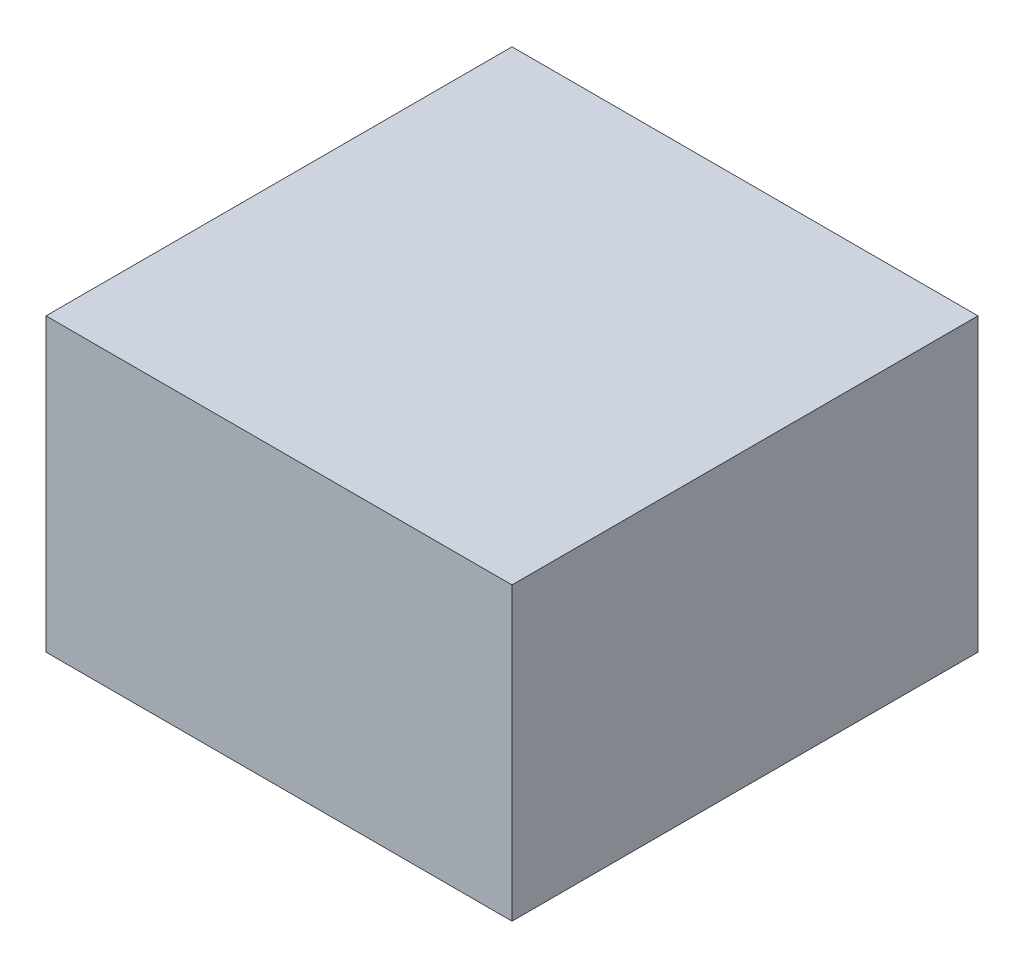
ISO-10303-21;
HEADER;
FILE_DESCRIPTION(('STEP AP214'),'2;1');
FILE_NAME('part.step','',(''),(''),'','','');
FILE_SCHEMA(('AUTOMOTIVE_DESIGN { 1 0 10303 214 1 1 1 1 }'));
ENDSEC;
DATA;
#1=APPLICATION_CONTEXT('core data for automotive mechanical design processes');
#2=APPLICATION_PROTOCOL_DEFINITION('international standard','automotive_design',2000,#1);
#3=PRODUCT_CONTEXT('',#1,'mechanical');
#4=PRODUCT('Part','Part','',(#3));
#5=PRODUCT_RELATED_PRODUCT_CATEGORY('part','',(#4));
#6=PRODUCT_DEFINITION_FORMATION('','',#4);
#7=PRODUCT_DEFINITION_CONTEXT('part definition',#1,'design');
#8=PRODUCT_DEFINITION('design','',#6,#7);
#9=PRODUCT_DEFINITION_SHAPE('','',#8);
#10=(LENGTH_UNIT() NAMED_UNIT(*) SI_UNIT(.MILLI.,.METRE.));
#11=(NAMED_UNIT(*) PLANE_ANGLE_UNIT() SI_UNIT($,.RADIAN.));
#12=(NAMED_UNIT(*) SI_UNIT($,.STERADIAN.) SOLID_ANGLE_UNIT());
#13=UNCERTAINTY_MEASURE_WITH_UNIT(LENGTH_MEASURE(1.E-05),#10,'distance_accuracy_value','');
#14=(GEOMETRIC_REPRESENTATION_CONTEXT(3) GLOBAL_UNCERTAINTY_ASSIGNED_CONTEXT((#13)) GLOBAL_UNIT_ASSIGNED_CONTEXT((#10,
#11,#12)) REPRESENTATION_CONTEXT('',''));
#15=CARTESIAN_POINT('',(0.,0.,0.));
#16=DIRECTION('',(0.,0.,1.));
#17=DIRECTION('',(1.,0.,0.));
#18=AXIS2_PLACEMENT_3D('',#15,#16,#17);
#19=CARTESIAN_POINT('',(0.,25.,40.));
#20=DIRECTION('',(1.,0.,0.));
#21=DIRECTION('',(0.,0.,-1.));
#22=AXIS2_PLACEMENT_3D('',#19,#20,#21);
#23=PLANE('',#22);
#24=DIRECTION('',(0.,-1.,0.));
#25=VECTOR('',#24,1.);
#26=CARTESIAN_POINT('',(0.,25.,0.));
#27=LINE('',#26,#25);
#28=CARTESIAN_POINT('',(0.,25.,0.));
#29=VERTEX_POINT('',#28);
#30=CARTESIAN_POINT('',(0.,0.,0.));
#31=VERTEX_POINT('',#30);
#32=EDGE_CURVE('E102',#29,#31,#27,.T.);
#33=ORIENTED_EDGE('',*,*,#32,.T.);
#34=DIRECTION('',(0.,0.,-1.));
#35=VECTOR('',#34,1.);
#36=CARTESIAN_POINT('',(0.,0.,40.));
#37=LINE('',#36,#35);
#38=CARTESIAN_POINT('',(0.,0.,40.));
#39=VERTEX_POINT('',#38);
#40=EDGE_CURVE('E11',#39,#31,#37,.T.);
#41=ORIENTED_EDGE('',*,*,#40,.F.);
#42=DIRECTION('',(0.,-1.,0.));
#43=VECTOR('',#42,1.);
#44=CARTESIAN_POINT('',(0.,25.,40.));
#45=LINE('',#44,#43);
#46=CARTESIAN_POINT('',(0.,25.,40.));
#47=VERTEX_POINT('',#46);
#48=EDGE_CURVE('E90',#47,#39,#45,.T.);
#49=ORIENTED_EDGE('',*,*,#48,.F.);
#50=DIRECTION('',(0.,0.,-1.));
#51=VECTOR('',#50,1.);
#52=CARTESIAN_POINT('',(0.,25.,40.));
#53=LINE('',#52,#51);
#54=EDGE_CURVE('E98',#47,#29,#53,.T.);
#55=ORIENTED_EDGE('',*,*,#54,.T.);
#56=EDGE_LOOP('',(#33,#41,#49,#55));
#57=FACE_BOUND('',#56,.T.);
#58=ADVANCED_FACE('F39',(#57),#23,.F.);
#59=CARTESIAN_POINT('',(0.,0.,40.));
#60=DIRECTION('',(0.,1.,0.));
#61=DIRECTION('',(0.,0.,1.));
#62=AXIS2_PLACEMENT_3D('',#59,#60,#61);
#63=PLANE('',#62);
#64=DIRECTION('',(1.,0.,0.));
#65=VECTOR('',#64,1.);
#66=CARTESIAN_POINT('',(0.,0.,0.));
#67=LINE('',#66,#65);
#68=CARTESIAN_POINT('',(40.,0.,0.));
#69=VERTEX_POINT('',#68);
#70=EDGE_CURVE('E94',#31,#69,#67,.T.);
#71=ORIENTED_EDGE('',*,*,#70,.T.);
#72=DIRECTION('',(0.,0.,-1.));
#73=VECTOR('',#72,1.);
#74=CARTESIAN_POINT('',(40.,0.,40.));
#75=LINE('',#74,#73);
#76=CARTESIAN_POINT('',(40.,0.,40.));
#77=VERTEX_POINT('',#76);
#78=EDGE_CURVE('E47',#77,#69,#75,.T.);
#79=ORIENTED_EDGE('',*,*,#78,.F.);
#80=DIRECTION('',(1.,0.,0.));
#81=VECTOR('',#80,1.);
#82=CARTESIAN_POINT('',(0.,0.,40.));
#83=LINE('',#82,#81);
#84=EDGE_CURVE('E85',#39,#77,#83,.T.);
#85=ORIENTED_EDGE('',*,*,#84,.F.);
#86=ORIENTED_EDGE('',*,*,#40,.T.);
#87=EDGE_LOOP('',(#71,#79,#85,#86));
#88=FACE_BOUND('',#87,.T.);
#89=ADVANCED_FACE('F93',(#88),#63,.F.);
#90=CARTESIAN_POINT('',(40.,0.,40.));
#91=DIRECTION('',(-1.,0.,0.));
#92=DIRECTION('',(0.,0.,1.));
#93=AXIS2_PLACEMENT_3D('',#90,#91,#92);
#94=PLANE('',#93);
#95=DIRECTION('',(0.,1.,0.));
#96=VECTOR('',#95,1.);
#97=CARTESIAN_POINT('',(40.,0.,0.));
#98=LINE('',#97,#96);
#99=CARTESIAN_POINT('',(40.,25.,0.));
#100=VERTEX_POINT('',#99);
#101=EDGE_CURVE('E72',#69,#100,#98,.T.);
#102=ORIENTED_EDGE('',*,*,#101,.T.);
#103=DIRECTION('',(0.,0.,-1.));
#104=VECTOR('',#103,1.);
#105=CARTESIAN_POINT('',(40.,25.,40.));
#106=LINE('',#105,#104);
#107=CARTESIAN_POINT('',(40.,25.,40.));
#108=VERTEX_POINT('',#107);
#109=EDGE_CURVE('E95',#108,#100,#106,.T.);
#110=ORIENTED_EDGE('',*,*,#109,.F.);
#111=DIRECTION('',(0.,1.,0.));
#112=VECTOR('',#111,1.);
#113=CARTESIAN_POINT('',(40.,0.,40.));
#114=LINE('',#113,#112);
#115=EDGE_CURVE('E88',#77,#108,#114,.T.);
#116=ORIENTED_EDGE('',*,*,#115,.F.);
#117=ORIENTED_EDGE('',*,*,#78,.T.);
#118=EDGE_LOOP('',(#102,#110,#116,#117));
#119=FACE_BOUND('',#118,.T.);
#120=ADVANCED_FACE('F96',(#119),#94,.F.);
#121=CARTESIAN_POINT('',(40.,25.,40.));
#122=DIRECTION('',(0.,-1.,0.));
#123=DIRECTION('',(0.,0.,-1.));
#124=AXIS2_PLACEMENT_3D('',#121,#122,#123);
#125=PLANE('',#124);
#126=DIRECTION('',(-1.,0.,0.));
#127=VECTOR('',#126,1.);
#128=CARTESIAN_POINT('',(40.,25.,0.));
#129=LINE('',#128,#127);
#130=EDGE_CURVE('E78',#100,#29,#129,.T.);
#131=ORIENTED_EDGE('',*,*,#130,.T.);
#132=ORIENTED_EDGE('',*,*,#54,.F.);
#133=DIRECTION('',(-1.,0.,0.));
#134=VECTOR('',#133,1.);
#135=CARTESIAN_POINT('',(40.,25.,40.));
#136=LINE('',#135,#134);
#137=EDGE_CURVE('E55',#108,#47,#136,.T.);
#138=ORIENTED_EDGE('',*,*,#137,.F.);
#139=ORIENTED_EDGE('',*,*,#109,.T.);
#140=EDGE_LOOP('',(#131,#132,#138,#139));
#141=FACE_BOUND('',#140,.T.);
#142=ADVANCED_FACE('F109',(#141),#125,.F.);
#143=CARTESIAN_POINT('',(0.,0.,40.));
#144=DIRECTION('',(0.,0.,1.));
#145=DIRECTION('',(1.,0.,0.));
#146=AXIS2_PLACEMENT_3D('',#143,#144,#145);
#147=PLANE('',#146);
#148=ORIENTED_EDGE('',*,*,#48,.T.);
#149=ORIENTED_EDGE('',*,*,#84,.T.);
#150=ORIENTED_EDGE('',*,*,#115,.T.);
#151=ORIENTED_EDGE('',*,*,#137,.T.);
#152=EDGE_LOOP('',(#148,#149,#150,#151));
#153=FACE_BOUND('',#152,.T.);
#154=ADVANCED_FACE('F86',(#153),#147,.T.);
#155=CARTESIAN_POINT('',(0.,0.,0.));
#156=DIRECTION('',(0.,0.,1.));
#157=DIRECTION('',(1.,0.,0.));
#158=AXIS2_PLACEMENT_3D('',#155,#156,#157);
#159=PLANE('',#158);
#160=ORIENTED_EDGE('',*,*,#32,.F.);
#161=ORIENTED_EDGE('',*,*,#130,.F.);
#162=ORIENTED_EDGE('',*,*,#101,.F.);
#163=ORIENTED_EDGE('',*,*,#70,.F.);
#164=EDGE_LOOP('',(#160,#161,#162,#163));
#165=FACE_BOUND('',#164,.T.);
#166=ADVANCED_FACE('F112',(#165),#159,.F.);
#167=CLOSED_SHELL('',(#58,#89,#120,#142,#154,#166));
#168=MANIFOLD_SOLID_BREP('B2',#167);
#169=ADVANCED_BREP_SHAPE_REPRESENTATION('',(#18,#168),#14);
#170=SHAPE_DEFINITION_REPRESENTATION(#9,#169);
ENDSEC;
END-ISO-10303-21;
